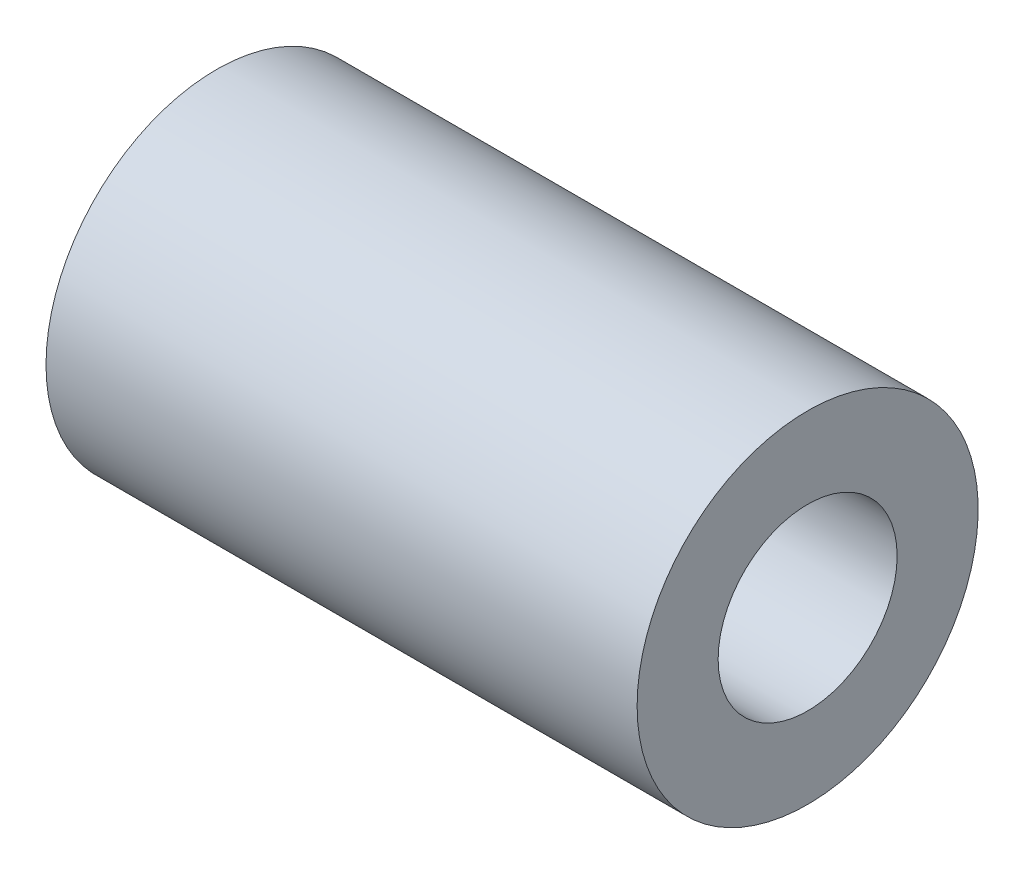
ISO-10303-21;
HEADER;
FILE_DESCRIPTION(('STEP AP214'),'2;1');
FILE_NAME('part.step','',(''),(''),'','','');
FILE_SCHEMA(('AUTOMOTIVE_DESIGN { 1 0 10303 214 1 1 1 1 }'));
ENDSEC;
DATA;
#1=APPLICATION_CONTEXT('core data for automotive mechanical design processes');
#2=APPLICATION_PROTOCOL_DEFINITION('international standard','automotive_design',2000,#1);
#3=PRODUCT_CONTEXT('',#1,'mechanical');
#4=PRODUCT('Part','Part','',(#3));
#5=PRODUCT_RELATED_PRODUCT_CATEGORY('part','',(#4));
#6=PRODUCT_DEFINITION_FORMATION('','',#4);
#7=PRODUCT_DEFINITION_CONTEXT('part definition',#1,'design');
#8=PRODUCT_DEFINITION('design','',#6,#7);
#9=PRODUCT_DEFINITION_SHAPE('','',#8);
#10=(LENGTH_UNIT() NAMED_UNIT(*) SI_UNIT(.MILLI.,.METRE.));
#11=(NAMED_UNIT(*) PLANE_ANGLE_UNIT() SI_UNIT($,.RADIAN.));
#12=(NAMED_UNIT(*) SI_UNIT($,.STERADIAN.) SOLID_ANGLE_UNIT());
#13=UNCERTAINTY_MEASURE_WITH_UNIT(LENGTH_MEASURE(1.E-05),#10,'distance_accuracy_value','');
#14=(GEOMETRIC_REPRESENTATION_CONTEXT(3) GLOBAL_UNCERTAINTY_ASSIGNED_CONTEXT((#13)) GLOBAL_UNIT_ASSIGNED_CONTEXT((#10,
#11,#12)) REPRESENTATION_CONTEXT('',''));
#15=CARTESIAN_POINT('',(0.,0.,0.));
#16=DIRECTION('',(0.,0.,1.));
#17=DIRECTION('',(1.,0.,0.));
#18=AXIS2_PLACEMENT_3D('',#15,#16,#17);
#19=CARTESIAN_POINT('',(52.,0.,0.));
#20=DIRECTION('',(1.,0.,0.));
#21=DIRECTION('',(0.,0.,-1.));
#22=AXIS2_PLACEMENT_3D('',#19,#20,#21);
#23=PLANE('',#22);
#24=CARTESIAN_POINT('',(52.,0.,0.));
#25=DIRECTION('',(1.,0.,0.));
#26=DIRECTION('',(0.,0.,-1.));
#27=AXIS2_PLACEMENT_3D('',#24,#25,#26);
#28=CIRCLE('',#27,15.);
#29=CARTESIAN_POINT('',(52.,0.,15.));
#30=VERTEX_POINT('',#29);
#31=EDGE_CURVE('E10',#30,#30,#28,.T.);
#32=ORIENTED_EDGE('',*,*,#31,.T.);
#33=EDGE_LOOP('',(#32));
#34=FACE_BOUND('',#33,.T.);
#35=CARTESIAN_POINT('',(52.,0.,0.));
#36=DIRECTION('',(1.,0.,0.));
#37=DIRECTION('',(0.,0.,-1.));
#38=AXIS2_PLACEMENT_3D('',#35,#36,#37);
#39=CIRCLE('',#38,7.874);
#40=CARTESIAN_POINT('',(52.,0.,7.87400000000001));
#41=VERTEX_POINT('',#40);
#42=EDGE_CURVE('E43',#41,#41,#39,.T.);
#43=ORIENTED_EDGE('',*,*,#42,.F.);
#44=EDGE_LOOP('',(#43));
#45=FACE_BOUND('',#44,.T.);
#46=ADVANCED_FACE('F32',(#34,#45),#23,.T.);
#47=CARTESIAN_POINT('',(0.,0.,0.));
#48=DIRECTION('',(1.,0.,0.));
#49=DIRECTION('',(0.,0.,-1.));
#50=AXIS2_PLACEMENT_3D('',#47,#48,#49);
#51=PLANE('',#50);
#52=CARTESIAN_POINT('',(0.,0.,0.));
#53=DIRECTION('',(1.,0.,0.));
#54=DIRECTION('',(0.,0.,-1.));
#55=AXIS2_PLACEMENT_3D('',#52,#53,#54);
#56=CIRCLE('',#55,15.);
#57=CARTESIAN_POINT('',(0.,0.,15.));
#58=VERTEX_POINT('',#57);
#59=EDGE_CURVE('E36',#58,#58,#56,.T.);
#60=ORIENTED_EDGE('',*,*,#59,.F.);
#61=EDGE_LOOP('',(#60));
#62=FACE_BOUND('',#61,.T.);
#63=CARTESIAN_POINT('',(0.,0.,0.));
#64=DIRECTION('',(1.,0.,0.));
#65=DIRECTION('',(0.,0.,-1.));
#66=AXIS2_PLACEMENT_3D('',#63,#64,#65);
#67=CIRCLE('',#66,7.874);
#68=CARTESIAN_POINT('',(0.,0.,7.87400000000001));
#69=VERTEX_POINT('',#68);
#70=EDGE_CURVE('E45',#69,#69,#67,.T.);
#71=ORIENTED_EDGE('',*,*,#70,.T.);
#72=EDGE_LOOP('',(#71));
#73=FACE_BOUND('',#72,.T.);
#74=ADVANCED_FACE('F55',(#62,#73),#51,.F.);
#75=CARTESIAN_POINT('',(52.,0.,0.));
#76=DIRECTION('',(-1.,0.,0.));
#77=DIRECTION('',(0.,0.,1.));
#78=AXIS2_PLACEMENT_3D('',#75,#76,#77);
#79=CYLINDRICAL_SURFACE('',#78,15.);
#80=CARTESIAN_POINT('',(52.,0.,15.));
#81=CARTESIAN_POINT('',(51.4583333333333,0.,15.));
#82=CARTESIAN_POINT('',(50.9166666666667,0.,15.));
#83=CARTESIAN_POINT('',(49.8333333333333,0.,15.));
#84=CARTESIAN_POINT('',(49.2916666666667,0.,15.));
#85=CARTESIAN_POINT('',(48.2083333333333,0.,15.));
#86=CARTESIAN_POINT('',(47.6666666666667,0.,15.));
#87=CARTESIAN_POINT('',(46.5833333333333,0.,15.));
#88=CARTESIAN_POINT('',(46.0416666666667,0.,15.));
#89=CARTESIAN_POINT('',(44.9583333333333,0.,15.));
#90=CARTESIAN_POINT('',(44.4166666666667,0.,15.));
#91=CARTESIAN_POINT('',(43.3333333333333,0.,15.));
#92=CARTESIAN_POINT('',(42.7916666666667,0.,15.));
#93=CARTESIAN_POINT('',(41.7083333333333,0.,15.));
#94=CARTESIAN_POINT('',(41.1666666666667,0.,15.));
#95=CARTESIAN_POINT('',(40.0833333333333,0.,15.));
#96=CARTESIAN_POINT('',(39.5416666666667,0.,15.));
#97=CARTESIAN_POINT('',(38.4583333333333,0.,15.));
#98=CARTESIAN_POINT('',(37.9166666666667,0.,15.));
#99=CARTESIAN_POINT('',(36.8333333333333,0.,15.));
#100=CARTESIAN_POINT('',(36.2916666666667,0.,15.));
#101=CARTESIAN_POINT('',(35.2083333333333,0.,15.));
#102=CARTESIAN_POINT('',(34.6666666666667,0.,15.));
#103=CARTESIAN_POINT('',(33.5833333333333,0.,15.));
#104=CARTESIAN_POINT('',(33.0416666666667,0.,15.));
#105=CARTESIAN_POINT('',(31.9583333333333,0.,15.));
#106=CARTESIAN_POINT('',(31.4166666666667,0.,15.));
#107=CARTESIAN_POINT('',(30.3333333333333,0.,15.));
#108=CARTESIAN_POINT('',(29.7916666666667,0.,15.));
#109=CARTESIAN_POINT('',(28.7083333333333,0.,15.));
#110=CARTESIAN_POINT('',(28.1666666666667,0.,15.));
#111=CARTESIAN_POINT('',(27.0833333333333,0.,15.));
#112=CARTESIAN_POINT('',(26.5416666666667,0.,15.));
#113=CARTESIAN_POINT('',(25.4583333333333,0.,15.));
#114=CARTESIAN_POINT('',(24.9166666666667,0.,15.));
#115=CARTESIAN_POINT('',(23.8333333333333,0.,15.));
#116=CARTESIAN_POINT('',(23.2916666666667,0.,15.));
#117=CARTESIAN_POINT('',(22.2083333333333,0.,15.));
#118=CARTESIAN_POINT('',(21.6666666666667,0.,15.));
#119=CARTESIAN_POINT('',(20.5833333333333,0.,15.));
#120=CARTESIAN_POINT('',(20.0416666666667,0.,15.));
#121=CARTESIAN_POINT('',(18.9583333333333,0.,15.));
#122=CARTESIAN_POINT('',(18.4166666666667,0.,15.));
#123=CARTESIAN_POINT('',(17.3333333333333,0.,15.));
#124=CARTESIAN_POINT('',(16.7916666666667,0.,15.));
#125=CARTESIAN_POINT('',(15.7083333333333,0.,15.));
#126=CARTESIAN_POINT('',(15.1666666666667,0.,15.));
#127=CARTESIAN_POINT('',(14.0833333333333,0.,15.));
#128=CARTESIAN_POINT('',(13.5416666666667,0.,15.));
#129=CARTESIAN_POINT('',(12.4583333333333,0.,15.));
#130=CARTESIAN_POINT('',(11.9166666666667,0.,15.));
#131=CARTESIAN_POINT('',(10.8333333333333,0.,15.));
#132=CARTESIAN_POINT('',(10.2916666666667,0.,15.));
#133=CARTESIAN_POINT('',(9.20833333333333,0.,15.));
#134=CARTESIAN_POINT('',(8.66666666666667,0.,15.));
#135=CARTESIAN_POINT('',(7.58333333333333,0.,15.));
#136=CARTESIAN_POINT('',(7.04166666666667,0.,15.));
#137=CARTESIAN_POINT('',(5.95833333333333,0.,15.));
#138=CARTESIAN_POINT('',(5.41666666666667,0.,15.));
#139=CARTESIAN_POINT('',(4.33333333333333,0.,15.));
#140=CARTESIAN_POINT('',(3.79166666666667,0.,15.));
#141=CARTESIAN_POINT('',(2.70833333333334,0.,15.));
#142=CARTESIAN_POINT('',(2.16666666666667,0.,15.));
#143=CARTESIAN_POINT('',(1.08333333333333,0.,15.));
#144=CARTESIAN_POINT('',(0.541666666666667,0.,15.));
#145=CARTESIAN_POINT('',(0.,0.,15.));
#146=B_SPLINE_CURVE_WITH_KNOTS('',3,(#80,#81,#82,#83,#84,#85,#86,#87,#88,#89,#90,#91,#92,#93,
#94,#95,#96,#97,#98,#99,#100,#101,#102,#103,#104,#105,#106,#107,#108,#109,#110,#111,#112,#113,
#114,#115,#116,#117,#118,#119,#120,#121,#122,#123,#124,#125,#126,#127,#128,#129,#130,#131,#132,
#133,#134,#135,#136,#137,#138,#139,#140,#141,#142,#143,#144,#145),.UNSPECIFIED.,.F.,.F.,(4,2,2,
2,2,2,2,2,2,2,2,2,2,2,2,2,2,2,2,2,2,2,2,2,2,2,2,2,2,2,2,2,4),(0.,1.62499999999999,3.25,4.875,
6.49999999999999,8.12499999999999,9.74999999999999,11.375,13.,14.625,16.25,17.875,19.5,21.125,
22.75,24.375,26.,27.625,29.25,30.875,32.5,34.125,35.75,37.375,39.,40.625,42.25,43.875,45.5,
47.125,48.75,50.375,52.),.UNSPECIFIED.);
#147=EDGE_CURVE('BSEAM34',#30,#58,#146,.T.);
#148=ORIENTED_EDGE('',*,*,#31,.F.);
#149=ORIENTED_EDGE('',*,*,#59,.T.);
#150=ORIENTED_EDGE('',*,*,#147,.T.);
#151=ORIENTED_EDGE('',*,*,#147,.F.);
#152=EDGE_LOOP('',(#148,#150,#149,#151));
#153=FACE_BOUND('',#152,.T.);
#154=ADVANCED_FACE('F34',(#153),#79,.T.);
#155=CARTESIAN_POINT('',(52.,0.,0.));
#156=DIRECTION('',(-1.,0.,0.));
#157=DIRECTION('',(0.,0.,1.));
#158=AXIS2_PLACEMENT_3D('',#155,#156,#157);
#159=CYLINDRICAL_SURFACE('',#158,7.874);
#160=CARTESIAN_POINT('',(52.,0.,7.87400000000001));
#161=CARTESIAN_POINT('',(51.4583333333333,0.,7.87400000000001));
#162=CARTESIAN_POINT('',(50.9166666666667,0.,7.87400000000001));
#163=CARTESIAN_POINT('',(49.8333333333333,0.,7.87400000000001));
#164=CARTESIAN_POINT('',(49.2916666666667,0.,7.87400000000001));
#165=CARTESIAN_POINT('',(48.2083333333333,0.,7.87400000000001));
#166=CARTESIAN_POINT('',(47.6666666666667,0.,7.87400000000001));
#167=CARTESIAN_POINT('',(46.5833333333333,0.,7.87400000000001));
#168=CARTESIAN_POINT('',(46.0416666666667,0.,7.87400000000001));
#169=CARTESIAN_POINT('',(44.9583333333333,0.,7.87400000000001));
#170=CARTESIAN_POINT('',(44.4166666666667,0.,7.87400000000001));
#171=CARTESIAN_POINT('',(43.3333333333333,0.,7.87400000000001));
#172=CARTESIAN_POINT('',(42.7916666666667,0.,7.87400000000001));
#173=CARTESIAN_POINT('',(41.7083333333333,0.,7.87400000000001));
#174=CARTESIAN_POINT('',(41.1666666666667,0.,7.87400000000001));
#175=CARTESIAN_POINT('',(40.0833333333333,0.,7.87400000000001));
#176=CARTESIAN_POINT('',(39.5416666666667,0.,7.87400000000001));
#177=CARTESIAN_POINT('',(38.4583333333333,0.,7.87400000000001));
#178=CARTESIAN_POINT('',(37.9166666666667,0.,7.87400000000001));
#179=CARTESIAN_POINT('',(36.8333333333333,0.,7.87400000000001));
#180=CARTESIAN_POINT('',(36.2916666666667,0.,7.87400000000001));
#181=CARTESIAN_POINT('',(35.2083333333333,0.,7.87400000000001));
#182=CARTESIAN_POINT('',(34.6666666666667,0.,7.87400000000001));
#183=CARTESIAN_POINT('',(33.5833333333333,0.,7.87400000000001));
#184=CARTESIAN_POINT('',(33.0416666666667,0.,7.87400000000001));
#185=CARTESIAN_POINT('',(31.9583333333333,0.,7.87400000000001));
#186=CARTESIAN_POINT('',(31.4166666666667,0.,7.87400000000001));
#187=CARTESIAN_POINT('',(30.3333333333333,0.,7.87400000000001));
#188=CARTESIAN_POINT('',(29.7916666666667,0.,7.87400000000001));
#189=CARTESIAN_POINT('',(28.7083333333333,0.,7.87400000000001));
#190=CARTESIAN_POINT('',(28.1666666666667,0.,7.87400000000001));
#191=CARTESIAN_POINT('',(27.0833333333333,0.,7.87400000000001));
#192=CARTESIAN_POINT('',(26.5416666666667,0.,7.87400000000001));
#193=CARTESIAN_POINT('',(25.4583333333333,0.,7.87400000000001));
#194=CARTESIAN_POINT('',(24.9166666666667,0.,7.87400000000001));
#195=CARTESIAN_POINT('',(23.8333333333333,0.,7.87400000000001));
#196=CARTESIAN_POINT('',(23.2916666666667,0.,7.87400000000001));
#197=CARTESIAN_POINT('',(22.2083333333333,0.,7.87400000000001));
#198=CARTESIAN_POINT('',(21.6666666666667,0.,7.87400000000001));
#199=CARTESIAN_POINT('',(20.5833333333333,0.,7.87400000000001));
#200=CARTESIAN_POINT('',(20.0416666666667,0.,7.87400000000001));
#201=CARTESIAN_POINT('',(18.9583333333333,0.,7.87400000000001));
#202=CARTESIAN_POINT('',(18.4166666666667,0.,7.87400000000001));
#203=CARTESIAN_POINT('',(17.3333333333333,0.,7.87400000000001));
#204=CARTESIAN_POINT('',(16.7916666666667,0.,7.87400000000001));
#205=CARTESIAN_POINT('',(15.7083333333333,0.,7.87400000000001));
#206=CARTESIAN_POINT('',(15.1666666666667,0.,7.87400000000001));
#207=CARTESIAN_POINT('',(14.0833333333333,0.,7.87400000000001));
#208=CARTESIAN_POINT('',(13.5416666666667,0.,7.87400000000001));
#209=CARTESIAN_POINT('',(12.4583333333333,0.,7.87400000000001));
#210=CARTESIAN_POINT('',(11.9166666666667,0.,7.87400000000001));
#211=CARTESIAN_POINT('',(10.8333333333333,0.,7.87400000000001));
#212=CARTESIAN_POINT('',(10.2916666666667,0.,7.87400000000001));
#213=CARTESIAN_POINT('',(9.20833333333333,0.,7.87400000000001));
#214=CARTESIAN_POINT('',(8.66666666666667,0.,7.87400000000001));
#215=CARTESIAN_POINT('',(7.58333333333333,0.,7.87400000000001));
#216=CARTESIAN_POINT('',(7.04166666666667,0.,7.87400000000001));
#217=CARTESIAN_POINT('',(5.95833333333333,0.,7.87400000000001));
#218=CARTESIAN_POINT('',(5.41666666666667,0.,7.87400000000001));
#219=CARTESIAN_POINT('',(4.33333333333333,0.,7.87400000000001));
#220=CARTESIAN_POINT('',(3.79166666666667,0.,7.87400000000001));
#221=CARTESIAN_POINT('',(2.70833333333334,0.,7.87400000000001));
#222=CARTESIAN_POINT('',(2.16666666666667,0.,7.87400000000001));
#223=CARTESIAN_POINT('',(1.08333333333333,0.,7.87400000000001));
#224=CARTESIAN_POINT('',(0.541666666666667,0.,7.87400000000001));
#225=CARTESIAN_POINT('',(0.,0.,7.87400000000001));
#226=B_SPLINE_CURVE_WITH_KNOTS('',3,(#160,#161,#162,#163,#164,#165,#166,#167,#168,#169,#170,
#171,#172,#173,#174,#175,#176,#177,#178,#179,#180,#181,#182,#183,#184,#185,#186,#187,#188,#189,
#190,#191,#192,#193,#194,#195,#196,#197,#198,#199,#200,#201,#202,#203,#204,#205,#206,#207,#208,
#209,#210,#211,#212,#213,#214,#215,#216,#217,#218,#219,#220,#221,#222,#223,#224,#225),
.UNSPECIFIED.,.F.,.F.,(4,2,2,2,2,2,2,2,2,2,2,2,2,2,2,2,2,2,2,2,2,2,2,2,2,2,2,2,2,2,2,2,4),(0.,
1.62499999999999,3.25,4.875,6.49999999999999,8.12499999999999,9.74999999999999,11.375,13.,
14.625,16.25,17.875,19.5,21.125,22.75,24.375,26.,27.625,29.25,30.875,32.5,34.125,35.75,37.375,
39.,40.625,42.25,43.875,45.5,47.125,48.75,50.375,52.),.UNSPECIFIED.);
#227=EDGE_CURVE('BSEAM51',#41,#69,#226,.T.);
#228=ORIENTED_EDGE('',*,*,#42,.T.);
#229=ORIENTED_EDGE('',*,*,#70,.F.);
#230=ORIENTED_EDGE('',*,*,#227,.T.);
#231=ORIENTED_EDGE('',*,*,#227,.F.);
#232=EDGE_LOOP('',(#228,#230,#229,#231));
#233=FACE_BOUND('',#232,.T.);
#234=ADVANCED_FACE('F51',(#233),#159,.F.);
#235=CLOSED_SHELL('',(#46,#74,#154,#234));
#236=MANIFOLD_SOLID_BREP('B2',#235);
#237=ADVANCED_BREP_SHAPE_REPRESENTATION('',(#18,#236),#14);
#238=SHAPE_DEFINITION_REPRESENTATION(#9,#237);
ENDSEC;
END-ISO-10303-21;
